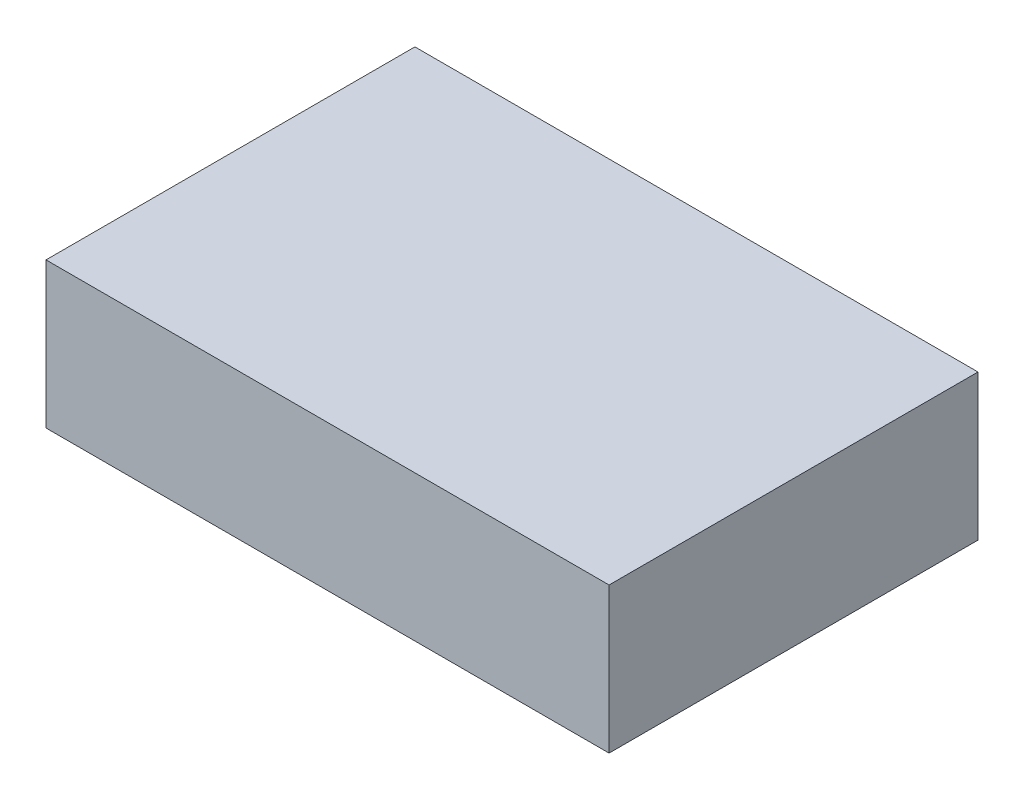
ISO-10303-21;
HEADER;
FILE_DESCRIPTION(('STEP AP214'),'2;1');
FILE_NAME('part.step','',(''),(''),'','','');
FILE_SCHEMA(('AUTOMOTIVE_DESIGN { 1 0 10303 214 1 1 1 1 }'));
ENDSEC;
DATA;
#1=APPLICATION_CONTEXT('core data for automotive mechanical design processes');
#2=APPLICATION_PROTOCOL_DEFINITION('international standard','automotive_design',2000,#1);
#3=PRODUCT_CONTEXT('',#1,'mechanical');
#4=PRODUCT('Part','Part','',(#3));
#5=PRODUCT_RELATED_PRODUCT_CATEGORY('part','',(#4));
#6=PRODUCT_DEFINITION_FORMATION('','',#4);
#7=PRODUCT_DEFINITION_CONTEXT('part definition',#1,'design');
#8=PRODUCT_DEFINITION('design','',#6,#7);
#9=PRODUCT_DEFINITION_SHAPE('','',#8);
#10=(LENGTH_UNIT() NAMED_UNIT(*) SI_UNIT(.MILLI.,.METRE.));
#11=(NAMED_UNIT(*) PLANE_ANGLE_UNIT() SI_UNIT($,.RADIAN.));
#12=(NAMED_UNIT(*) SI_UNIT($,.STERADIAN.) SOLID_ANGLE_UNIT());
#13=UNCERTAINTY_MEASURE_WITH_UNIT(LENGTH_MEASURE(1.E-05),#10,'distance_accuracy_value','');
#14=(GEOMETRIC_REPRESENTATION_CONTEXT(3) GLOBAL_UNCERTAINTY_ASSIGNED_CONTEXT((#13)) GLOBAL_UNIT_ASSIGNED_CONTEXT((#10,
#11,#12)) REPRESENTATION_CONTEXT('',''));
#15=CARTESIAN_POINT('',(0.,0.,0.));
#16=DIRECTION('',(0.,0.,1.));
#17=DIRECTION('',(1.,0.,0.));
#18=AXIS2_PLACEMENT_3D('',#15,#16,#17);
#19=CARTESIAN_POINT('',(0.,15.,0.));
#20=DIRECTION('',(1.,0.,0.));
#21=DIRECTION('',(0.,0.,-1.));
#22=AXIS2_PLACEMENT_3D('',#19,#20,#21);
#23=PLANE('',#22);
#24=DIRECTION('',(0.,0.,1.));
#25=VECTOR('',#24,1.);
#26=CARTESIAN_POINT('',(0.,0.,0.));
#27=LINE('',#26,#25);
#28=CARTESIAN_POINT('',(0.,0.,0.));
#29=VERTEX_POINT('',#28);
#30=CARTESIAN_POINT('',(0.,0.,38.));
#31=VERTEX_POINT('',#30);
#32=EDGE_CURVE('E107',#29,#31,#27,.T.);
#33=ORIENTED_EDGE('',*,*,#32,.T.);
#34=DIRECTION('',(0.,-1.,0.));
#35=VECTOR('',#34,1.);
#36=CARTESIAN_POINT('',(0.,15.,38.));
#37=LINE('',#36,#35);
#38=CARTESIAN_POINT('',(0.,15.,38.));
#39=VERTEX_POINT('',#38);
#40=EDGE_CURVE('E11',#39,#31,#37,.T.);
#41=ORIENTED_EDGE('',*,*,#40,.F.);
#42=DIRECTION('',(0.,0.,1.));
#43=VECTOR('',#42,1.);
#44=CARTESIAN_POINT('',(0.,15.,0.));
#45=LINE('',#44,#43);
#46=CARTESIAN_POINT('',(0.,15.,0.));
#47=VERTEX_POINT('',#46);
#48=EDGE_CURVE('E91',#47,#39,#45,.T.);
#49=ORIENTED_EDGE('',*,*,#48,.F.);
#50=DIRECTION('',(0.,-1.,0.));
#51=VECTOR('',#50,1.);
#52=CARTESIAN_POINT('',(0.,15.,0.));
#53=LINE('',#52,#51);
#54=EDGE_CURVE('E103',#47,#29,#53,.T.);
#55=ORIENTED_EDGE('',*,*,#54,.T.);
#56=EDGE_LOOP('',(#33,#41,#49,#55));
#57=FACE_BOUND('',#56,.T.);
#58=ADVANCED_FACE('F39',(#57),#23,.F.);
#59=CARTESIAN_POINT('',(0.,15.,38.));
#60=DIRECTION('',(0.,0.,-1.));
#61=DIRECTION('',(-1.,0.,0.));
#62=AXIS2_PLACEMENT_3D('',#59,#60,#61);
#63=PLANE('',#62);
#64=DIRECTION('',(1.,0.,0.));
#65=VECTOR('',#64,1.);
#66=CARTESIAN_POINT('',(0.,0.,38.));
#67=LINE('',#66,#65);
#68=CARTESIAN_POINT('',(58.,0.,38.));
#69=VERTEX_POINT('',#68);
#70=EDGE_CURVE('E96',#31,#69,#67,.T.);
#71=ORIENTED_EDGE('',*,*,#70,.T.);
#72=DIRECTION('',(0.,-1.,0.));
#73=VECTOR('',#72,1.);
#74=CARTESIAN_POINT('',(58.,15.,38.));
#75=LINE('',#74,#73);
#76=CARTESIAN_POINT('',(58.,15.,38.));
#77=VERTEX_POINT('',#76);
#78=EDGE_CURVE('E48',#77,#69,#75,.T.);
#79=ORIENTED_EDGE('',*,*,#78,.F.);
#80=DIRECTION('',(1.,0.,0.));
#81=VECTOR('',#80,1.);
#82=CARTESIAN_POINT('',(0.,15.,38.));
#83=LINE('',#82,#81);
#84=EDGE_CURVE('E86',#39,#77,#83,.T.);
#85=ORIENTED_EDGE('',*,*,#84,.F.);
#86=ORIENTED_EDGE('',*,*,#40,.T.);
#87=EDGE_LOOP('',(#71,#79,#85,#86));
#88=FACE_BOUND('',#87,.T.);
#89=ADVANCED_FACE('F95',(#88),#63,.F.);
#90=CARTESIAN_POINT('',(58.,15.,0.));
#91=DIRECTION('',(-1.,0.,0.));
#92=DIRECTION('',(0.,0.,1.));
#93=AXIS2_PLACEMENT_3D('',#90,#91,#92);
#94=PLANE('',#93);
#95=DIRECTION('',(0.,0.,-1.));
#96=VECTOR('',#95,1.);
#97=CARTESIAN_POINT('',(58.,0.,0.));
#98=LINE('',#97,#96);
#99=CARTESIAN_POINT('',(58.,0.,0.));
#100=VERTEX_POINT('',#99);
#101=EDGE_CURVE('E73',#69,#100,#98,.T.);
#102=ORIENTED_EDGE('',*,*,#101,.T.);
#103=DIRECTION('',(0.,-1.,0.));
#104=VECTOR('',#103,1.);
#105=CARTESIAN_POINT('',(58.,15.,0.));
#106=LINE('',#105,#104);
#107=CARTESIAN_POINT('',(58.,15.,0.));
#108=VERTEX_POINT('',#107);
#109=EDGE_CURVE('E98',#108,#100,#106,.T.);
#110=ORIENTED_EDGE('',*,*,#109,.F.);
#111=DIRECTION('',(0.,0.,-1.));
#112=VECTOR('',#111,1.);
#113=CARTESIAN_POINT('',(58.,15.,0.));
#114=LINE('',#113,#112);
#115=EDGE_CURVE('E89',#77,#108,#114,.T.);
#116=ORIENTED_EDGE('',*,*,#115,.F.);
#117=ORIENTED_EDGE('',*,*,#78,.T.);
#118=EDGE_LOOP('',(#102,#110,#116,#117));
#119=FACE_BOUND('',#118,.T.);
#120=ADVANCED_FACE('F99',(#119),#94,.F.);
#121=CARTESIAN_POINT('',(0.,15.,0.));
#122=DIRECTION('',(0.,0.,1.));
#123=DIRECTION('',(1.,0.,0.));
#124=AXIS2_PLACEMENT_3D('',#121,#122,#123);
#125=PLANE('',#124);
#126=DIRECTION('',(-1.,0.,0.));
#127=VECTOR('',#126,1.);
#128=CARTESIAN_POINT('',(0.,0.,0.));
#129=LINE('',#128,#127);
#130=EDGE_CURVE('E79',#100,#29,#129,.T.);
#131=ORIENTED_EDGE('',*,*,#130,.T.);
#132=ORIENTED_EDGE('',*,*,#54,.F.);
#133=DIRECTION('',(-1.,0.,0.));
#134=VECTOR('',#133,1.);
#135=CARTESIAN_POINT('',(0.,15.,0.));
#136=LINE('',#135,#134);
#137=EDGE_CURVE('E56',#108,#47,#136,.T.);
#138=ORIENTED_EDGE('',*,*,#137,.F.);
#139=ORIENTED_EDGE('',*,*,#109,.T.);
#140=EDGE_LOOP('',(#131,#132,#138,#139));
#141=FACE_BOUND('',#140,.T.);
#142=ADVANCED_FACE('F120',(#141),#125,.F.);
#143=CARTESIAN_POINT('',(0.,15.,0.));
#144=DIRECTION('',(0.,1.,0.));
#145=DIRECTION('',(0.,0.,1.));
#146=AXIS2_PLACEMENT_3D('',#143,#144,#145);
#147=PLANE('',#146);
#148=ORIENTED_EDGE('',*,*,#48,.T.);
#149=ORIENTED_EDGE('',*,*,#84,.T.);
#150=ORIENTED_EDGE('',*,*,#115,.T.);
#151=ORIENTED_EDGE('',*,*,#137,.T.);
#152=EDGE_LOOP('',(#148,#149,#150,#151));
#153=FACE_BOUND('',#152,.T.);
#154=ADVANCED_FACE('F87',(#153),#147,.T.);
#155=CARTESIAN_POINT('',(0.,0.,0.));
#156=DIRECTION('',(0.,1.,0.));
#157=DIRECTION('',(0.,0.,1.));
#158=AXIS2_PLACEMENT_3D('',#155,#156,#157);
#159=PLANE('',#158);
#160=ORIENTED_EDGE('',*,*,#32,.F.);
#161=ORIENTED_EDGE('',*,*,#130,.F.);
#162=ORIENTED_EDGE('',*,*,#101,.F.);
#163=ORIENTED_EDGE('',*,*,#70,.F.);
#164=EDGE_LOOP('',(#160,#161,#162,#163));
#165=FACE_BOUND('',#164,.T.);
#166=ADVANCED_FACE('F123',(#165),#159,.F.);
#167=CLOSED_SHELL('',(#58,#89,#120,#142,#154,#166));
#168=MANIFOLD_SOLID_BREP('B2',#167);
#169=ADVANCED_BREP_SHAPE_REPRESENTATION('',(#18,#168),#14);
#170=SHAPE_DEFINITION_REPRESENTATION(#9,#169);
ENDSEC;
END-ISO-10303-21;
